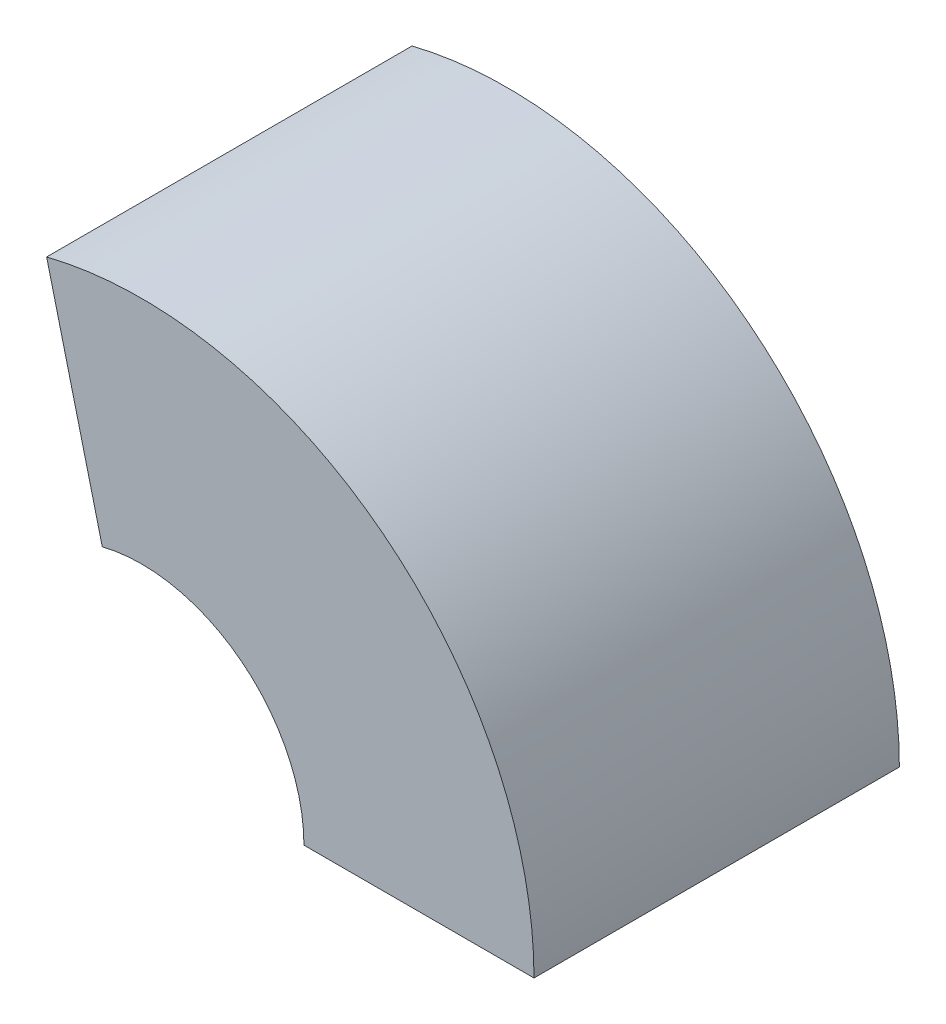
ISO-10303-21;
HEADER;
FILE_DESCRIPTION(('STEP AP214'),'2;1');
FILE_NAME('part.step','',(''),(''),'','','');
FILE_SCHEMA(('AUTOMOTIVE_DESIGN { 1 0 10303 214 1 1 1 1 }'));
ENDSEC;
DATA;
#1=APPLICATION_CONTEXT('core data for automotive mechanical design processes');
#2=APPLICATION_PROTOCOL_DEFINITION('international standard','automotive_design',2000,#1);
#3=PRODUCT_CONTEXT('',#1,'mechanical');
#4=PRODUCT('Part','Part','',(#3));
#5=PRODUCT_RELATED_PRODUCT_CATEGORY('part','',(#4));
#6=PRODUCT_DEFINITION_FORMATION('','',#4);
#7=PRODUCT_DEFINITION_CONTEXT('part definition',#1,'design');
#8=PRODUCT_DEFINITION('design','',#6,#7);
#9=PRODUCT_DEFINITION_SHAPE('','',#8);
#10=(LENGTH_UNIT() NAMED_UNIT(*) SI_UNIT(.MILLI.,.METRE.));
#11=(NAMED_UNIT(*) PLANE_ANGLE_UNIT() SI_UNIT($,.RADIAN.));
#12=(NAMED_UNIT(*) SI_UNIT($,.STERADIAN.) SOLID_ANGLE_UNIT());
#13=UNCERTAINTY_MEASURE_WITH_UNIT(LENGTH_MEASURE(1.E-05),#10,'distance_accuracy_value','');
#14=(GEOMETRIC_REPRESENTATION_CONTEXT(3) GLOBAL_UNCERTAINTY_ASSIGNED_CONTEXT((#13)) GLOBAL_UNIT_ASSIGNED_CONTEXT((#10,
#11,#12)) REPRESENTATION_CONTEXT('',''));
#15=CARTESIAN_POINT('',(0.,0.,0.));
#16=DIRECTION('',(0.,0.,1.));
#17=DIRECTION('',(1.,0.,0.));
#18=AXIS2_PLACEMENT_3D('',#15,#16,#17);
#19=CARTESIAN_POINT('',(4.,0.,16.));
#20=DIRECTION('',(0.,0.,-1.));
#21=DIRECTION('',(-1.,0.,0.));
#22=AXIS2_PLACEMENT_3D('',#19,#20,#21);
#23=CYLINDRICAL_SURFACE('',#22,12.);
#24=CARTESIAN_POINT('',(4.,0.,-16.));
#25=DIRECTION('',(0.,0.,-1.));
#26=DIRECTION('',(-1.,0.,0.));
#27=AXIS2_PLACEMENT_3D('',#24,#25,#26);
#28=CIRCLE('',#27,12.);
#29=CARTESIAN_POINT('',(1.09693725280399,11.643548715312,-16.));
#30=VERTEX_POINT('',#29);
#31=CARTESIAN_POINT('',(16.,0.,-16.));
#32=VERTEX_POINT('',#31);
#33=EDGE_CURVE('E11',#30,#32,#28,.T.);
#34=ORIENTED_EDGE('',*,*,#33,.T.);
#35=DIRECTION('',(0.,0.,1.));
#36=VECTOR('',#35,1.);
#37=CARTESIAN_POINT('',(16.,0.,11.));
#38=LINE('',#37,#36);
#39=CARTESIAN_POINT('',(16.,0.,11.));
#40=VERTEX_POINT('',#39);
#41=EDGE_CURVE('E98',#32,#40,#38,.T.);
#42=ORIENTED_EDGE('',*,*,#41,.T.);
#43=CARTESIAN_POINT('',(4.,0.,11.));
#44=DIRECTION('',(0.,0.,-1.));
#45=DIRECTION('',(-1.,0.,0.));
#46=AXIS2_PLACEMENT_3D('',#43,#44,#45);
#47=CIRCLE('',#46,12.);
#48=CARTESIAN_POINT('',(1.09693725280399,11.643548715312,11.));
#49=VERTEX_POINT('',#48);
#50=EDGE_CURVE('E83',#49,#40,#47,.T.);
#51=ORIENTED_EDGE('',*,*,#50,.F.);
#52=DIRECTION('',(0.,0.,1.));
#53=VECTOR('',#52,1.);
#54=CARTESIAN_POINT('',(1.09693725280399,11.643548715312,11.));
#55=LINE('',#54,#53);
#56=EDGE_CURVE('E109',#30,#49,#55,.T.);
#57=ORIENTED_EDGE('',*,*,#56,.F.);
#58=EDGE_LOOP('',(#34,#42,#51,#57));
#59=FACE_BOUND('',#58,.T.);
#60=ADVANCED_FACE('F41',(#59),#23,.F.);
#61=CARTESIAN_POINT('',(1.09693725280399,11.643548715312,-16.));
#62=DIRECTION('',(0.,0.,1.));
#63=DIRECTION('',(1.,0.,0.));
#64=AXIS2_PLACEMENT_3D('',#61,#62,#63);
#65=PLANE('',#64);
#66=CARTESIAN_POINT('',(4.,0.,-16.));
#67=DIRECTION('',(0.,0.,-1.));
#68=DIRECTION('',(-1.,0.,0.));
#69=AXIS2_PLACEMENT_3D('',#66,#67,#68);
#70=CIRCLE('',#69,29.);
#71=CARTESIAN_POINT('',(-3.01573497239037,28.1385760620039,-16.));
#72=VERTEX_POINT('',#71);
#73=CARTESIAN_POINT('',(33.,0.,-16.));
#74=VERTEX_POINT('',#73);
#75=EDGE_CURVE('E47',#72,#74,#70,.T.);
#76=ORIENTED_EDGE('',*,*,#75,.T.);
#77=DIRECTION('',(-1.,0.,0.));
#78=VECTOR('',#77,1.);
#79=CARTESIAN_POINT('',(16.,0.,-16.));
#80=LINE('',#79,#78);
#81=EDGE_CURVE('E103',#74,#32,#80,.T.);
#82=ORIENTED_EDGE('',*,*,#81,.T.);
#83=ORIENTED_EDGE('',*,*,#33,.F.);
#84=DIRECTION('',(0.241921895599668,-0.970295726275996,0.));
#85=VECTOR('',#84,1.);
#86=CARTESIAN_POINT('',(1.09693725280399,11.643548715312,-16.));
#87=LINE('',#86,#85);
#88=EDGE_CURVE('E93',#72,#30,#87,.T.);
#89=ORIENTED_EDGE('',*,*,#88,.F.);
#90=EDGE_LOOP('',(#76,#82,#83,#89));
#91=FACE_BOUND('',#90,.T.);
#92=ADVANCED_FACE('F43',(#91),#65,.F.);
#93=CARTESIAN_POINT('',(4.,0.,16.));
#94=DIRECTION('',(0.,0.,-1.));
#95=DIRECTION('',(-1.,0.,0.));
#96=AXIS2_PLACEMENT_3D('',#93,#94,#95);
#97=CYLINDRICAL_SURFACE('',#96,29.);
#98=CARTESIAN_POINT('',(4.,0.,11.));
#99=DIRECTION('',(0.,0.,-1.));
#100=DIRECTION('',(-1.,0.,0.));
#101=AXIS2_PLACEMENT_3D('',#98,#99,#100);
#102=CIRCLE('',#101,29.);
#103=CARTESIAN_POINT('',(-3.01573497239037,28.1385760620039,11.));
#104=VERTEX_POINT('',#103);
#105=CARTESIAN_POINT('',(33.,0.,11.));
#106=VERTEX_POINT('',#105);
#107=EDGE_CURVE('E95',#104,#106,#102,.T.);
#108=ORIENTED_EDGE('',*,*,#107,.T.);
#109=DIRECTION('',(0.,0.,-1.));
#110=VECTOR('',#109,1.);
#111=CARTESIAN_POINT('',(33.,0.,11.));
#112=LINE('',#111,#110);
#113=EDGE_CURVE('E99',#106,#74,#112,.T.);
#114=ORIENTED_EDGE('',*,*,#113,.T.);
#115=ORIENTED_EDGE('',*,*,#75,.F.);
#116=DIRECTION('',(0.,0.,-1.));
#117=VECTOR('',#116,1.);
#118=CARTESIAN_POINT('',(-3.01573497239037,28.1385760620039,11.));
#119=LINE('',#118,#117);
#120=EDGE_CURVE('E108',#104,#72,#119,.T.);
#121=ORIENTED_EDGE('',*,*,#120,.F.);
#122=EDGE_LOOP('',(#108,#114,#115,#121));
#123=FACE_BOUND('',#122,.T.);
#124=ADVANCED_FACE('F111',(#123),#97,.T.);
#125=CARTESIAN_POINT('',(1.09693725280399,11.643548715312,11.));
#126=DIRECTION('',(0.,0.,-1.));
#127=DIRECTION('',(-1.,0.,0.));
#128=AXIS2_PLACEMENT_3D('',#125,#126,#127);
#129=PLANE('',#128);
#130=DIRECTION('',(-0.241921895599668,0.970295726275996,0.));
#131=VECTOR('',#130,1.);
#132=CARTESIAN_POINT('',(1.09693725280399,11.643548715312,11.));
#133=LINE('',#132,#131);
#134=EDGE_CURVE('E90',#49,#104,#133,.T.);
#135=ORIENTED_EDGE('',*,*,#134,.F.);
#136=ORIENTED_EDGE('',*,*,#50,.T.);
#137=DIRECTION('',(1.,0.,0.));
#138=VECTOR('',#137,1.);
#139=CARTESIAN_POINT('',(16.,0.,11.));
#140=LINE('',#139,#138);
#141=EDGE_CURVE('E84',#40,#106,#140,.T.);
#142=ORIENTED_EDGE('',*,*,#141,.T.);
#143=ORIENTED_EDGE('',*,*,#107,.F.);
#144=EDGE_LOOP('',(#135,#136,#142,#143));
#145=FACE_BOUND('',#144,.T.);
#146=ADVANCED_FACE('F81',(#145),#129,.F.);
#147=CARTESIAN_POINT('',(4.96768758239867,-3.88118290510399,0.));
#148=DIRECTION('',(0.970295726275996,0.241921895599668,0.));
#149=DIRECTION('',(0.,0.,-1.));
#150=AXIS2_PLACEMENT_3D('',#147,#148,#149);
#151=PLANE('',#150);
#152=ORIENTED_EDGE('',*,*,#56,.T.);
#153=ORIENTED_EDGE('',*,*,#134,.T.);
#154=ORIENTED_EDGE('',*,*,#120,.T.);
#155=ORIENTED_EDGE('',*,*,#88,.T.);
#156=EDGE_LOOP('',(#152,#153,#154,#155));
#157=FACE_BOUND('',#156,.T.);
#158=ADVANCED_FACE('F113',(#157),#151,.F.);
#159=CARTESIAN_POINT('',(0.,0.,0.));
#160=DIRECTION('',(0.,-1.,0.));
#161=DIRECTION('',(0.,0.,-1.));
#162=AXIS2_PLACEMENT_3D('',#159,#160,#161);
#163=PLANE('',#162);
#164=ORIENTED_EDGE('',*,*,#41,.F.);
#165=ORIENTED_EDGE('',*,*,#81,.F.);
#166=ORIENTED_EDGE('',*,*,#113,.F.);
#167=ORIENTED_EDGE('',*,*,#141,.F.);
#168=EDGE_LOOP('',(#164,#165,#166,#167));
#169=FACE_BOUND('',#168,.T.);
#170=ADVANCED_FACE('F100',(#169),#163,.T.);
#171=CLOSED_SHELL('',(#60,#92,#124,#146,#158,#170));
#172=MANIFOLD_SOLID_BREP('B2',#171);
#173=ADVANCED_BREP_SHAPE_REPRESENTATION('',(#18,#172),#14);
#174=SHAPE_DEFINITION_REPRESENTATION(#9,#173);
ENDSEC;
END-ISO-10303-21;
